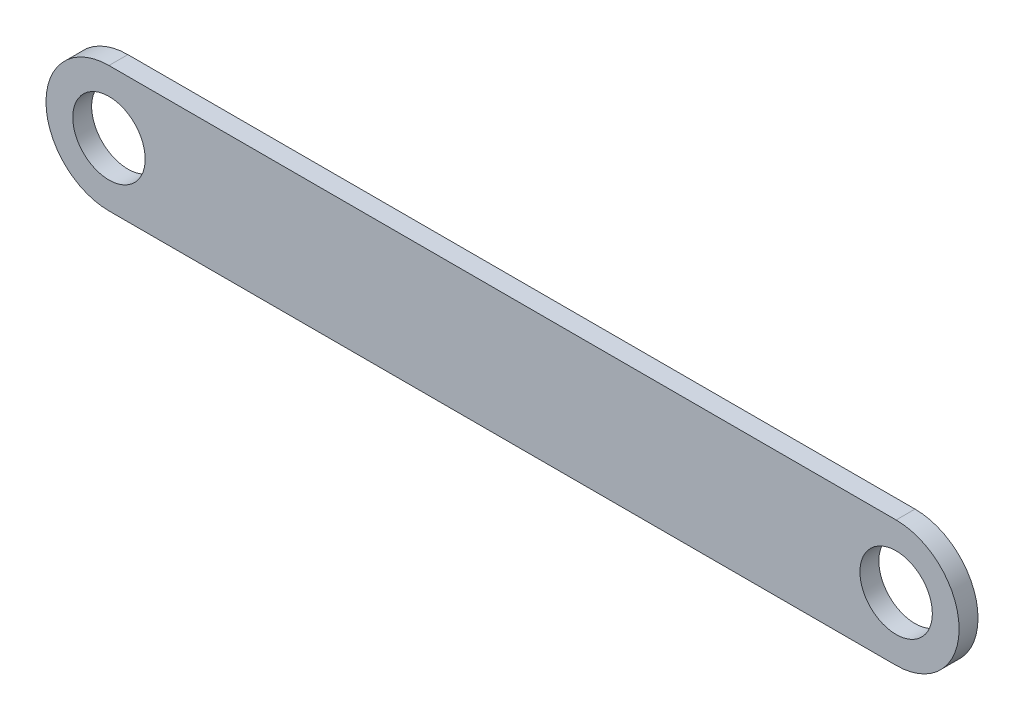
ISO-10303-21;
HEADER;
FILE_DESCRIPTION(('STEP AP214'),'2;1');
FILE_NAME('part.step','',(''),(''),'','','');
FILE_SCHEMA(('AUTOMOTIVE_DESIGN { 1 0 10303 214 1 1 1 1 }'));
ENDSEC;
DATA;
#1=APPLICATION_CONTEXT('core data for automotive mechanical design processes');
#2=APPLICATION_PROTOCOL_DEFINITION('international standard','automotive_design',2000,#1);
#3=PRODUCT_CONTEXT('',#1,'mechanical');
#4=PRODUCT('Part','Part','',(#3));
#5=PRODUCT_RELATED_PRODUCT_CATEGORY('part','',(#4));
#6=PRODUCT_DEFINITION_FORMATION('','',#4);
#7=PRODUCT_DEFINITION_CONTEXT('part definition',#1,'design');
#8=PRODUCT_DEFINITION('design','',#6,#7);
#9=PRODUCT_DEFINITION_SHAPE('','',#8);
#10=(LENGTH_UNIT() NAMED_UNIT(*) SI_UNIT(.MILLI.,.METRE.));
#11=(NAMED_UNIT(*) PLANE_ANGLE_UNIT() SI_UNIT($,.RADIAN.));
#12=(NAMED_UNIT(*) SI_UNIT($,.STERADIAN.) SOLID_ANGLE_UNIT());
#13=UNCERTAINTY_MEASURE_WITH_UNIT(LENGTH_MEASURE(1.E-05),#10,'distance_accuracy_value','');
#14=(GEOMETRIC_REPRESENTATION_CONTEXT(3) GLOBAL_UNCERTAINTY_ASSIGNED_CONTEXT((#13)) GLOBAL_UNIT_ASSIGNED_CONTEXT((#10,
#11,#12)) REPRESENTATION_CONTEXT('',''));
#15=CARTESIAN_POINT('',(0.,0.,0.));
#16=DIRECTION('',(0.,0.,1.));
#17=DIRECTION('',(1.,0.,0.));
#18=AXIS2_PLACEMENT_3D('',#15,#16,#17);
#19=CARTESIAN_POINT('',(-62.5,0.,3.));
#20=DIRECTION('',(0.,0.,1.));
#21=DIRECTION('',(1.,0.,0.));
#22=AXIS2_PLACEMENT_3D('',#19,#20,#21);
#23=PLANE('',#22);
#24=CARTESIAN_POINT('',(-62.5,0.,3.));
#25=DIRECTION('',(0.,0.,1.));
#26=DIRECTION('',(1.,0.,0.));
#27=AXIS2_PLACEMENT_3D('',#24,#25,#26);
#28=CIRCLE('',#27,5.75);
#29=CARTESIAN_POINT('',(-56.75,0.,3.));
#30=VERTEX_POINT('',#29);
#31=EDGE_CURVE('E102',#30,#30,#28,.T.);
#32=ORIENTED_EDGE('',*,*,#31,.F.);
#33=EDGE_LOOP('',(#32));
#34=FACE_BOUND('',#33,.T.);
#35=CARTESIAN_POINT('',(-62.5,0.,3.));
#36=DIRECTION('',(0.,0.,1.));
#37=DIRECTION('',(1.,0.,0.));
#38=AXIS2_PLACEMENT_3D('',#35,#36,#37);
#39=CIRCLE('',#38,10.);
#40=CARTESIAN_POINT('',(-62.5,10.,3.));
#41=VERTEX_POINT('',#40);
#42=CARTESIAN_POINT('',(-62.5,-10.,3.));
#43=VERTEX_POINT('',#42);
#44=EDGE_CURVE('E87',#41,#43,#39,.T.);
#45=ORIENTED_EDGE('',*,*,#44,.T.);
#46=DIRECTION('',(1.,0.,0.));
#47=VECTOR('',#46,1.);
#48=CARTESIAN_POINT('',(-62.5,-10.,3.));
#49=LINE('',#48,#47);
#50=CARTESIAN_POINT('',(62.5,-10.,3.));
#51=VERTEX_POINT('',#50);
#52=EDGE_CURVE('E82',#43,#51,#49,.T.);
#53=ORIENTED_EDGE('',*,*,#52,.T.);
#54=CARTESIAN_POINT('',(62.5,0.,3.));
#55=DIRECTION('',(0.,0.,1.));
#56=DIRECTION('',(1.,0.,0.));
#57=AXIS2_PLACEMENT_3D('',#54,#55,#56);
#58=CIRCLE('',#57,10.);
#59=CARTESIAN_POINT('',(62.5,10.,3.));
#60=VERTEX_POINT('',#59);
#61=EDGE_CURVE('E85',#51,#60,#58,.T.);
#62=ORIENTED_EDGE('',*,*,#61,.T.);
#63=DIRECTION('',(-1.,0.,0.));
#64=VECTOR('',#63,1.);
#65=CARTESIAN_POINT('',(-62.5,10.,3.));
#66=LINE('',#65,#64);
#67=EDGE_CURVE('E52',#60,#41,#66,.T.);
#68=ORIENTED_EDGE('',*,*,#67,.T.);
#69=EDGE_LOOP('',(#45,#53,#62,#68));
#70=FACE_BOUND('',#69,.T.);
#71=CARTESIAN_POINT('',(62.5,0.,3.));
#72=DIRECTION('',(0.,0.,1.));
#73=DIRECTION('',(1.,0.,0.));
#74=AXIS2_PLACEMENT_3D('',#71,#72,#73);
#75=CIRCLE('',#74,5.75);
#76=CARTESIAN_POINT('',(68.25,0.,3.));
#77=VERTEX_POINT('',#76);
#78=EDGE_CURVE('E117',#77,#77,#75,.T.);
#79=ORIENTED_EDGE('',*,*,#78,.F.);
#80=EDGE_LOOP('',(#79));
#81=FACE_BOUND('',#80,.T.);
#82=ADVANCED_FACE('F35',(#34,#70,#81),#23,.T.);
#83=CARTESIAN_POINT('',(-62.5,0.,0.));
#84=DIRECTION('',(0.,0.,1.));
#85=DIRECTION('',(1.,0.,0.));
#86=AXIS2_PLACEMENT_3D('',#83,#84,#85);
#87=PLANE('',#86);
#88=CARTESIAN_POINT('',(-62.5,0.,0.));
#89=DIRECTION('',(0.,0.,1.));
#90=DIRECTION('',(1.,0.,0.));
#91=AXIS2_PLACEMENT_3D('',#88,#89,#90);
#92=CIRCLE('',#91,10.);
#93=CARTESIAN_POINT('',(-62.5,10.,0.));
#94=VERTEX_POINT('',#93);
#95=CARTESIAN_POINT('',(-62.5,-10.,0.));
#96=VERTEX_POINT('',#95);
#97=EDGE_CURVE('E99',#94,#96,#92,.T.);
#98=ORIENTED_EDGE('',*,*,#97,.F.);
#99=DIRECTION('',(-1.,0.,0.));
#100=VECTOR('',#99,1.);
#101=CARTESIAN_POINT('',(-62.5,10.,0.));
#102=LINE('',#101,#100);
#103=CARTESIAN_POINT('',(62.5,10.,0.));
#104=VERTEX_POINT('',#103);
#105=EDGE_CURVE('E75',#104,#94,#102,.T.);
#106=ORIENTED_EDGE('',*,*,#105,.F.);
#107=CARTESIAN_POINT('',(62.5,0.,0.));
#108=DIRECTION('',(0.,0.,1.));
#109=DIRECTION('',(1.,0.,0.));
#110=AXIS2_PLACEMENT_3D('',#107,#108,#109);
#111=CIRCLE('',#110,10.);
#112=CARTESIAN_POINT('',(62.5,-10.,0.));
#113=VERTEX_POINT('',#112);
#114=EDGE_CURVE('E69',#113,#104,#111,.T.);
#115=ORIENTED_EDGE('',*,*,#114,.F.);
#116=DIRECTION('',(1.,0.,0.));
#117=VECTOR('',#116,1.);
#118=CARTESIAN_POINT('',(-62.5,-10.,0.));
#119=LINE('',#118,#117);
#120=EDGE_CURVE('E91',#96,#113,#119,.T.);
#121=ORIENTED_EDGE('',*,*,#120,.F.);
#122=EDGE_LOOP('',(#98,#106,#115,#121));
#123=FACE_BOUND('',#122,.T.);
#124=CARTESIAN_POINT('',(-62.5,0.,0.));
#125=DIRECTION('',(0.,0.,1.));
#126=DIRECTION('',(1.,0.,0.));
#127=AXIS2_PLACEMENT_3D('',#124,#125,#126);
#128=CIRCLE('',#127,5.75);
#129=CARTESIAN_POINT('',(-56.75,0.,0.));
#130=VERTEX_POINT('',#129);
#131=EDGE_CURVE('E114',#130,#130,#128,.T.);
#132=ORIENTED_EDGE('',*,*,#131,.T.);
#133=EDGE_LOOP('',(#132));
#134=FACE_BOUND('',#133,.T.);
#135=CARTESIAN_POINT('',(62.5,0.,0.));
#136=DIRECTION('',(0.,0.,1.));
#137=DIRECTION('',(1.,0.,0.));
#138=AXIS2_PLACEMENT_3D('',#135,#136,#137);
#139=CIRCLE('',#138,5.75);
#140=CARTESIAN_POINT('',(68.25,0.,0.));
#141=VERTEX_POINT('',#140);
#142=EDGE_CURVE('E120',#141,#141,#139,.T.);
#143=ORIENTED_EDGE('',*,*,#142,.T.);
#144=EDGE_LOOP('',(#143));
#145=FACE_BOUND('',#144,.T.);
#146=ADVANCED_FACE('F110',(#123,#134,#145),#87,.F.);
#147=CARTESIAN_POINT('',(-62.5,0.,3.));
#148=DIRECTION('',(0.,0.,-1.));
#149=DIRECTION('',(-1.,0.,0.));
#150=AXIS2_PLACEMENT_3D('',#147,#148,#149);
#151=CYLINDRICAL_SURFACE('',#150,10.);
#152=ORIENTED_EDGE('',*,*,#97,.T.);
#153=DIRECTION('',(0.,0.,-1.));
#154=VECTOR('',#153,1.);
#155=CARTESIAN_POINT('',(-62.5,-10.,3.));
#156=LINE('',#155,#154);
#157=EDGE_CURVE('E11',#43,#96,#156,.T.);
#158=ORIENTED_EDGE('',*,*,#157,.F.);
#159=ORIENTED_EDGE('',*,*,#44,.F.);
#160=DIRECTION('',(0.,0.,-1.));
#161=VECTOR('',#160,1.);
#162=CARTESIAN_POINT('',(-62.5,10.,3.));
#163=LINE('',#162,#161);
#164=EDGE_CURVE('E95',#41,#94,#163,.T.);
#165=ORIENTED_EDGE('',*,*,#164,.T.);
#166=EDGE_LOOP('',(#152,#158,#159,#165));
#167=FACE_BOUND('',#166,.T.);
#168=ADVANCED_FACE('F37',(#167),#151,.T.);
#169=CARTESIAN_POINT('',(-62.5,-10.,3.));
#170=DIRECTION('',(0.,1.,0.));
#171=DIRECTION('',(0.,0.,1.));
#172=AXIS2_PLACEMENT_3D('',#169,#170,#171);
#173=PLANE('',#172);
#174=ORIENTED_EDGE('',*,*,#120,.T.);
#175=DIRECTION('',(0.,0.,-1.));
#176=VECTOR('',#175,1.);
#177=CARTESIAN_POINT('',(62.5,-10.,3.));
#178=LINE('',#177,#176);
#179=EDGE_CURVE('E44',#51,#113,#178,.T.);
#180=ORIENTED_EDGE('',*,*,#179,.F.);
#181=ORIENTED_EDGE('',*,*,#52,.F.);
#182=ORIENTED_EDGE('',*,*,#157,.T.);
#183=EDGE_LOOP('',(#174,#180,#181,#182));
#184=FACE_BOUND('',#183,.T.);
#185=ADVANCED_FACE('F90',(#184),#173,.F.);
#186=CARTESIAN_POINT('',(62.5,0.,3.));
#187=DIRECTION('',(0.,0.,-1.));
#188=DIRECTION('',(-1.,0.,0.));
#189=AXIS2_PLACEMENT_3D('',#186,#187,#188);
#190=CYLINDRICAL_SURFACE('',#189,10.);
#191=ORIENTED_EDGE('',*,*,#114,.T.);
#192=DIRECTION('',(0.,0.,-1.));
#193=VECTOR('',#192,1.);
#194=CARTESIAN_POINT('',(62.5,10.,3.));
#195=LINE('',#194,#193);
#196=EDGE_CURVE('E92',#60,#104,#195,.T.);
#197=ORIENTED_EDGE('',*,*,#196,.F.);
#198=ORIENTED_EDGE('',*,*,#61,.F.);
#199=ORIENTED_EDGE('',*,*,#179,.T.);
#200=EDGE_LOOP('',(#191,#197,#198,#199));
#201=FACE_BOUND('',#200,.T.);
#202=ADVANCED_FACE('F93',(#201),#190,.T.);
#203=CARTESIAN_POINT('',(-62.5,10.,3.));
#204=DIRECTION('',(0.,-1.,0.));
#205=DIRECTION('',(0.,0.,-1.));
#206=AXIS2_PLACEMENT_3D('',#203,#204,#205);
#207=PLANE('',#206);
#208=ORIENTED_EDGE('',*,*,#105,.T.);
#209=ORIENTED_EDGE('',*,*,#164,.F.);
#210=ORIENTED_EDGE('',*,*,#67,.F.);
#211=ORIENTED_EDGE('',*,*,#196,.T.);
#212=EDGE_LOOP('',(#208,#209,#210,#211));
#213=FACE_BOUND('',#212,.T.);
#214=ADVANCED_FACE('F107',(#213),#207,.F.);
#215=CARTESIAN_POINT('',(-62.5,0.,3.));
#216=DIRECTION('',(0.,0.,-1.));
#217=DIRECTION('',(-1.,0.,0.));
#218=AXIS2_PLACEMENT_3D('',#215,#216,#217);
#219=CYLINDRICAL_SURFACE('',#218,5.75);
#220=ORIENTED_EDGE('',*,*,#31,.T.);
#221=EDGE_LOOP('',(#220));
#222=FACE_BOUND('',#221,.T.);
#223=ORIENTED_EDGE('',*,*,#131,.F.);
#224=EDGE_LOOP('',(#223));
#225=FACE_BOUND('',#224,.T.);
#226=ADVANCED_FACE('F137',(#222,#225),#219,.F.);
#227=CARTESIAN_POINT('',(62.5,0.,3.));
#228=DIRECTION('',(0.,0.,-1.));
#229=DIRECTION('',(-1.,0.,0.));
#230=AXIS2_PLACEMENT_3D('',#227,#228,#229);
#231=CYLINDRICAL_SURFACE('',#230,5.75);
#232=ORIENTED_EDGE('',*,*,#78,.T.);
#233=EDGE_LOOP('',(#232));
#234=FACE_BOUND('',#233,.T.);
#235=ORIENTED_EDGE('',*,*,#142,.F.);
#236=EDGE_LOOP('',(#235));
#237=FACE_BOUND('',#236,.T.);
#238=ADVANCED_FACE('F126',(#234,#237),#231,.F.);
#239=CLOSED_SHELL('',(#82,#146,#168,#185,#202,#214,#226,#238));
#240=MANIFOLD_SOLID_BREP('B2',#239);
#241=ADVANCED_BREP_SHAPE_REPRESENTATION('',(#18,#240),#14);
#242=SHAPE_DEFINITION_REPRESENTATION(#9,#241);
ENDSEC;
END-ISO-10303-21;
